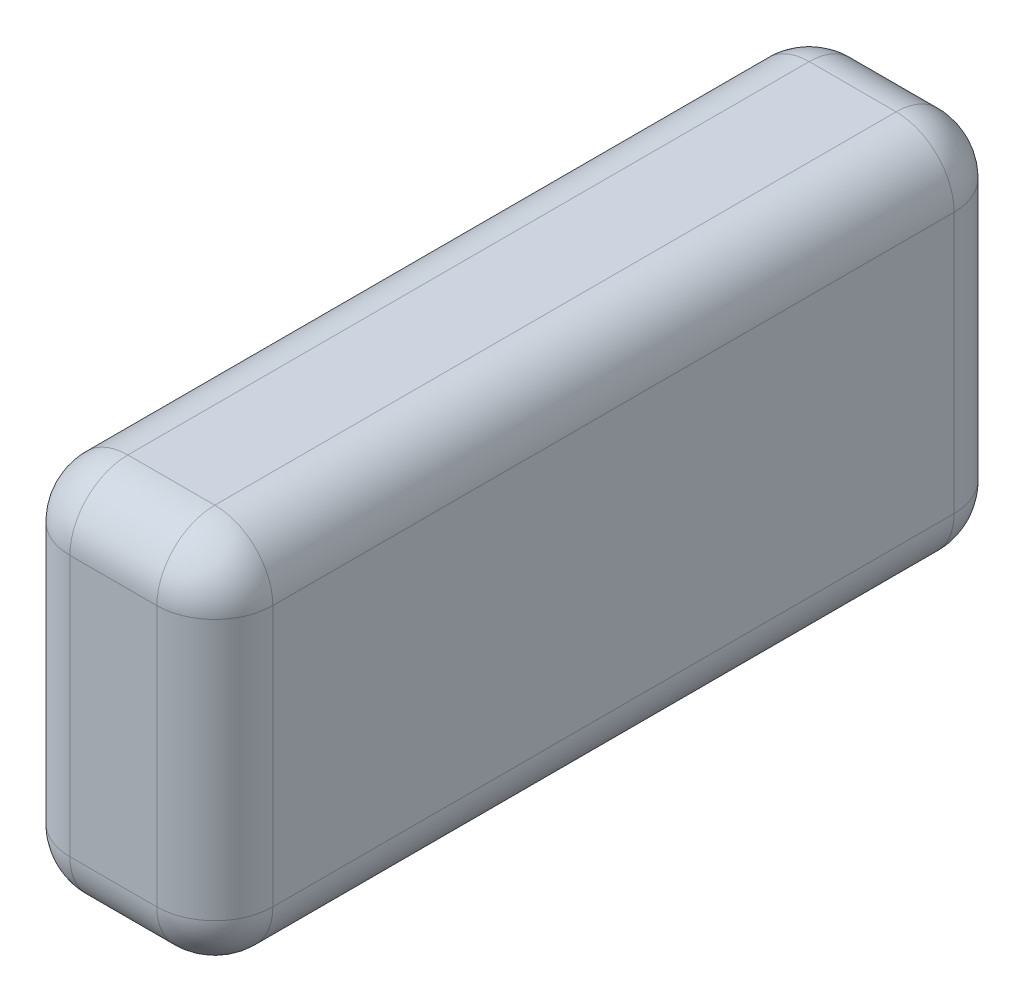
ISO-10303-21;
HEADER;
FILE_DESCRIPTION(('STEP AP214'),'2;1');
FILE_NAME('part.step','',(''),(''),'','','');
FILE_SCHEMA(('AUTOMOTIVE_DESIGN { 1 0 10303 214 1 1 1 1 }'));
ENDSEC;
DATA;
#1=APPLICATION_CONTEXT('core data for automotive mechanical design processes');
#2=APPLICATION_PROTOCOL_DEFINITION('international standard','automotive_design',2000,#1);
#3=PRODUCT_CONTEXT('',#1,'mechanical');
#4=PRODUCT('Part','Part','',(#3));
#5=PRODUCT_RELATED_PRODUCT_CATEGORY('part','',(#4));
#6=PRODUCT_DEFINITION_FORMATION('','',#4);
#7=PRODUCT_DEFINITION_CONTEXT('part definition',#1,'design');
#8=PRODUCT_DEFINITION('design','',#6,#7);
#9=PRODUCT_DEFINITION_SHAPE('','',#8);
#10=(LENGTH_UNIT() NAMED_UNIT(*) SI_UNIT(.MILLI.,.METRE.));
#11=(NAMED_UNIT(*) PLANE_ANGLE_UNIT() SI_UNIT($,.RADIAN.));
#12=(NAMED_UNIT(*) SI_UNIT($,.STERADIAN.) SOLID_ANGLE_UNIT());
#13=UNCERTAINTY_MEASURE_WITH_UNIT(LENGTH_MEASURE(1.E-05),#10,'distance_accuracy_value','');
#14=(GEOMETRIC_REPRESENTATION_CONTEXT(3) GLOBAL_UNCERTAINTY_ASSIGNED_CONTEXT((#13)) GLOBAL_UNIT_ASSIGNED_CONTEXT((#10,
#11,#12)) REPRESENTATION_CONTEXT('',''));
#15=CARTESIAN_POINT('',(0.,0.,0.));
#16=DIRECTION('',(0.,0.,1.));
#17=DIRECTION('',(1.,0.,0.));
#18=AXIS2_PLACEMENT_3D('',#15,#16,#17);
#19=CARTESIAN_POINT('',(-14.,-26.,110.));
#20=DIRECTION('',(1.,0.,0.));
#21=DIRECTION('',(0.,0.,-1.));
#22=AXIS2_PLACEMENT_3D('',#19,#20,#21);
#23=PLANE('',#22);
#24=DIRECTION('',(0.,-1.,0.));
#25=VECTOR('',#24,1.);
#26=CARTESIAN_POINT('',(-14.,26.,102.));
#27=LINE('',#26,#25);
#28=CARTESIAN_POINT('',(-14.,-18.,102.));
#29=VERTEX_POINT('',#28);
#30=CARTESIAN_POINT('',(-14.,18.,102.));
#31=VERTEX_POINT('',#30);
#32=EDGE_CURVE('E193',#29,#31,#27,.F.);
#33=ORIENTED_EDGE('',*,*,#32,.T.);
#34=DIRECTION('',(0.,0.,-1.));
#35=VECTOR('',#34,1.);
#36=CARTESIAN_POINT('',(-14.,18.,110.));
#37=LINE('',#36,#35);
#38=CARTESIAN_POINT('',(-14.,18.,7.99999999999999));
#39=VERTEX_POINT('',#38);
#40=EDGE_CURVE('E198',#31,#39,#37,.T.);
#41=ORIENTED_EDGE('',*,*,#40,.T.);
#42=DIRECTION('',(0.,-1.,0.));
#43=VECTOR('',#42,1.);
#44=CARTESIAN_POINT('',(-14.,-26.,7.99999999999999));
#45=LINE('',#44,#43);
#46=CARTESIAN_POINT('',(-14.,-18.,7.99999999999999));
#47=VERTEX_POINT('',#46);
#48=EDGE_CURVE('E195',#39,#47,#45,.T.);
#49=ORIENTED_EDGE('',*,*,#48,.T.);
#50=DIRECTION('',(0.,0.,-1.));
#51=VECTOR('',#50,1.);
#52=CARTESIAN_POINT('',(-14.,-18.,110.));
#53=LINE('',#52,#51);
#54=EDGE_CURVE('E191',#47,#29,#53,.F.);
#55=ORIENTED_EDGE('',*,*,#54,.T.);
#56=EDGE_LOOP('',(#33,#41,#49,#55));
#57=FACE_BOUND('',#56,.T.);
#58=ADVANCED_FACE('F39',(#57),#23,.F.);
#59=CARTESIAN_POINT('',(14.,-26.,110.));
#60=DIRECTION('',(0.,1.,0.));
#61=DIRECTION('',(-1.,0.,0.));
#62=AXIS2_PLACEMENT_3D('',#59,#60,#61);
#63=PLANE('',#62);
#64=DIRECTION('',(1.,0.,0.));
#65=VECTOR('',#64,1.);
#66=CARTESIAN_POINT('',(-14.,-26.,102.));
#67=LINE('',#66,#65);
#68=CARTESIAN_POINT('',(6.,-26.,102.));
#69=VERTEX_POINT('',#68);
#70=CARTESIAN_POINT('',(-6.,-26.,102.));
#71=VERTEX_POINT('',#70);
#72=EDGE_CURVE('E156',#69,#71,#67,.F.);
#73=ORIENTED_EDGE('',*,*,#72,.T.);
#74=DIRECTION('',(0.,0.,-1.));
#75=VECTOR('',#74,1.);
#76=CARTESIAN_POINT('',(-5.99999999999999,-26.,110.));
#77=LINE('',#76,#75);
#78=CARTESIAN_POINT('',(-6.,-26.,7.99999999999999));
#79=VERTEX_POINT('',#78);
#80=EDGE_CURVE('E160',#71,#79,#77,.T.);
#81=ORIENTED_EDGE('',*,*,#80,.T.);
#82=DIRECTION('',(1.,0.,0.));
#83=VECTOR('',#82,1.);
#84=CARTESIAN_POINT('',(14.,-26.,7.99999999999999));
#85=LINE('',#84,#83);
#86=CARTESIAN_POINT('',(6.,-26.,7.99999999999999));
#87=VERTEX_POINT('',#86);
#88=EDGE_CURVE('E132',#79,#87,#85,.T.);
#89=ORIENTED_EDGE('',*,*,#88,.T.);
#90=DIRECTION('',(0.,0.,-1.));
#91=VECTOR('',#90,1.);
#92=CARTESIAN_POINT('',(6.,-26.,110.));
#93=LINE('',#92,#91);
#94=EDGE_CURVE('E150',#87,#69,#93,.F.);
#95=ORIENTED_EDGE('',*,*,#94,.T.);
#96=EDGE_LOOP('',(#73,#81,#89,#95));
#97=FACE_BOUND('',#96,.T.);
#98=ADVANCED_FACE('F158',(#97),#63,.F.);
#99=CARTESIAN_POINT('',(14.,-26.,110.));
#100=DIRECTION('',(-1.,0.,0.));
#101=DIRECTION('',(0.,0.,1.));
#102=AXIS2_PLACEMENT_3D('',#99,#100,#101);
#103=PLANE('',#102);
#104=DIRECTION('',(0.,1.,0.));
#105=VECTOR('',#104,1.);
#106=CARTESIAN_POINT('',(14.,-26.,7.99999999999999));
#107=LINE('',#106,#105);
#108=CARTESIAN_POINT('',(14.,-18.,7.99999999999999));
#109=VERTEX_POINT('',#108);
#110=CARTESIAN_POINT('',(14.,18.,7.99999999999999));
#111=VERTEX_POINT('',#110);
#112=EDGE_CURVE('E177',#109,#111,#107,.T.);
#113=ORIENTED_EDGE('',*,*,#112,.T.);
#114=DIRECTION('',(0.,0.,-1.));
#115=VECTOR('',#114,1.);
#116=CARTESIAN_POINT('',(14.,18.,110.));
#117=LINE('',#116,#115);
#118=CARTESIAN_POINT('',(14.,18.,102.));
#119=VERTEX_POINT('',#118);
#120=EDGE_CURVE('E180',#111,#119,#117,.F.);
#121=ORIENTED_EDGE('',*,*,#120,.T.);
#122=DIRECTION('',(0.,1.,0.));
#123=VECTOR('',#122,1.);
#124=CARTESIAN_POINT('',(14.,-26.,102.));
#125=LINE('',#124,#123);
#126=CARTESIAN_POINT('',(14.,-18.,102.));
#127=VERTEX_POINT('',#126);
#128=EDGE_CURVE('E175',#119,#127,#125,.F.);
#129=ORIENTED_EDGE('',*,*,#128,.T.);
#130=DIRECTION('',(0.,0.,-1.));
#131=VECTOR('',#130,1.);
#132=CARTESIAN_POINT('',(14.,-18.,110.));
#133=LINE('',#132,#131);
#134=EDGE_CURVE('E173',#127,#109,#133,.T.);
#135=ORIENTED_EDGE('',*,*,#134,.T.);
#136=EDGE_LOOP('',(#113,#121,#129,#135));
#137=FACE_BOUND('',#136,.T.);
#138=ADVANCED_FACE('F333',(#137),#103,.F.);
#139=CARTESIAN_POINT('',(14.,26.,110.));
#140=DIRECTION('',(0.,-1.,0.));
#141=DIRECTION('',(1.,0.,0.));
#142=AXIS2_PLACEMENT_3D('',#139,#140,#141);
#143=PLANE('',#142);
#144=DIRECTION('',(-1.,0.,0.));
#145=VECTOR('',#144,1.);
#146=CARTESIAN_POINT('',(14.,26.,7.99999999999999));
#147=LINE('',#146,#145);
#148=CARTESIAN_POINT('',(6.,26.,7.99999999999999));
#149=VERTEX_POINT('',#148);
#150=CARTESIAN_POINT('',(-6.,26.,7.99999999999999));
#151=VERTEX_POINT('',#150);
#152=EDGE_CURVE('E186',#149,#151,#147,.T.);
#153=ORIENTED_EDGE('',*,*,#152,.T.);
#154=DIRECTION('',(0.,0.,-1.));
#155=VECTOR('',#154,1.);
#156=CARTESIAN_POINT('',(-6.,26.,110.));
#157=LINE('',#156,#155);
#158=CARTESIAN_POINT('',(-6.,26.,102.));
#159=VERTEX_POINT('',#158);
#160=EDGE_CURVE('E189',#151,#159,#157,.F.);
#161=ORIENTED_EDGE('',*,*,#160,.T.);
#162=DIRECTION('',(-1.,0.,0.));
#163=VECTOR('',#162,1.);
#164=CARTESIAN_POINT('',(14.,26.,102.));
#165=LINE('',#164,#163);
#166=CARTESIAN_POINT('',(6.,26.,102.));
#167=VERTEX_POINT('',#166);
#168=EDGE_CURVE('E184',#159,#167,#165,.F.);
#169=ORIENTED_EDGE('',*,*,#168,.T.);
#170=DIRECTION('',(0.,0.,-1.));
#171=VECTOR('',#170,1.);
#172=CARTESIAN_POINT('',(6.,26.,110.));
#173=LINE('',#172,#171);
#174=EDGE_CURVE('E182',#167,#149,#173,.T.);
#175=ORIENTED_EDGE('',*,*,#174,.T.);
#176=EDGE_LOOP('',(#153,#161,#169,#175));
#177=FACE_BOUND('',#176,.T.);
#178=ADVANCED_FACE('F300',(#177),#143,.F.);
#179=CARTESIAN_POINT('',(0.,0.,110.));
#180=DIRECTION('',(0.,0.,1.));
#181=DIRECTION('',(1.,0.,0.));
#182=AXIS2_PLACEMENT_3D('',#179,#180,#181);
#183=PLANE('',#182);
#184=DIRECTION('',(0.,1.,0.));
#185=VECTOR('',#184,1.);
#186=CARTESIAN_POINT('',(6.,26.,110.));
#187=LINE('',#186,#185);
#188=CARTESIAN_POINT('',(6.,-18.,110.));
#189=VERTEX_POINT('',#188);
#190=CARTESIAN_POINT('',(6.,18.,110.));
#191=VERTEX_POINT('',#190);
#192=EDGE_CURVE('E48',#189,#191,#187,.T.);
#193=ORIENTED_EDGE('',*,*,#192,.T.);
#194=DIRECTION('',(-1.,0.,0.));
#195=VECTOR('',#194,1.);
#196=CARTESIAN_POINT('',(-14.,18.,110.));
#197=LINE('',#196,#195);
#198=CARTESIAN_POINT('',(-6.,18.,110.));
#199=VERTEX_POINT('',#198);
#200=EDGE_CURVE('E11',#191,#199,#197,.T.);
#201=ORIENTED_EDGE('',*,*,#200,.T.);
#202=DIRECTION('',(0.,-1.,0.));
#203=VECTOR('',#202,1.);
#204=CARTESIAN_POINT('',(-6.,-26.,110.));
#205=LINE('',#204,#203);
#206=CARTESIAN_POINT('',(-6.,-18.,110.));
#207=VERTEX_POINT('',#206);
#208=EDGE_CURVE('E200',#199,#207,#205,.T.);
#209=ORIENTED_EDGE('',*,*,#208,.T.);
#210=DIRECTION('',(1.,0.,0.));
#211=VECTOR('',#210,1.);
#212=CARTESIAN_POINT('',(14.,-18.,110.));
#213=LINE('',#212,#211);
#214=EDGE_CURVE('E59',#207,#189,#213,.T.);
#215=ORIENTED_EDGE('',*,*,#214,.T.);
#216=EDGE_LOOP('',(#193,#201,#209,#215));
#217=FACE_BOUND('',#216,.T.);
#218=ADVANCED_FACE('F280',(#217),#183,.T.);
#219=CARTESIAN_POINT('',(0.,0.,0.));
#220=DIRECTION('',(0.,0.,1.));
#221=DIRECTION('',(1.,0.,0.));
#222=AXIS2_PLACEMENT_3D('',#219,#220,#221);
#223=PLANE('',#222);
#224=DIRECTION('',(0.,1.,0.));
#225=VECTOR('',#224,1.);
#226=CARTESIAN_POINT('',(6.,0.,0.));
#227=LINE('',#226,#225);
#228=CARTESIAN_POINT('',(6.,18.,0.));
#229=VERTEX_POINT('',#228);
#230=CARTESIAN_POINT('',(6.,-18.,0.));
#231=VERTEX_POINT('',#230);
#232=EDGE_CURVE('E170',#229,#231,#227,.F.);
#233=ORIENTED_EDGE('',*,*,#232,.T.);
#234=DIRECTION('',(1.,0.,0.));
#235=VECTOR('',#234,1.);
#236=CARTESIAN_POINT('',(0.,-18.,0.));
#237=LINE('',#236,#235);
#238=CARTESIAN_POINT('',(-6.,-18.,0.));
#239=VERTEX_POINT('',#238);
#240=EDGE_CURVE('E134',#231,#239,#237,.F.);
#241=ORIENTED_EDGE('',*,*,#240,.T.);
#242=DIRECTION('',(0.,-1.,0.));
#243=VECTOR('',#242,1.);
#244=CARTESIAN_POINT('',(-6.,0.,0.));
#245=LINE('',#244,#243);
#246=CARTESIAN_POINT('',(-6.,18.,0.));
#247=VERTEX_POINT('',#246);
#248=EDGE_CURVE('E163',#239,#247,#245,.F.);
#249=ORIENTED_EDGE('',*,*,#248,.T.);
#250=DIRECTION('',(-1.,0.,0.));
#251=VECTOR('',#250,1.);
#252=CARTESIAN_POINT('',(0.,18.,0.));
#253=LINE('',#252,#251);
#254=EDGE_CURVE('E168',#247,#229,#253,.F.);
#255=ORIENTED_EDGE('',*,*,#254,.T.);
#256=EDGE_LOOP('',(#233,#241,#249,#255));
#257=FACE_BOUND('',#256,.T.);
#258=ADVANCED_FACE('F361',(#257),#223,.F.);
#259=CARTESIAN_POINT('',(0.,18.,102.));
#260=DIRECTION('',(1.,0.,0.));
#261=DIRECTION('',(0.,1.,0.));
#262=AXIS2_PLACEMENT_3D('',#259,#260,#261);
#263=CYLINDRICAL_SURFACE('',#262,8.);
#264=CARTESIAN_POINT('',(-6.,18.,102.));
#265=DIRECTION('',(-1.,0.,0.));
#266=DIRECTION('',(0.,-1.,0.));
#267=AXIS2_PLACEMENT_3D('',#264,#265,#266);
#268=CIRCLE('',#267,8.);
#269=EDGE_CURVE('E43',#199,#159,#268,.T.);
#270=ORIENTED_EDGE('',*,*,#269,.F.);
#271=ORIENTED_EDGE('',*,*,#200,.F.);
#272=CARTESIAN_POINT('',(6.,18.,102.));
#273=DIRECTION('',(1.,0.,0.));
#274=DIRECTION('',(0.,1.,0.));
#275=AXIS2_PLACEMENT_3D('',#272,#273,#274);
#276=CIRCLE('',#275,8.);
#277=EDGE_CURVE('E253',#167,#191,#276,.T.);
#278=ORIENTED_EDGE('',*,*,#277,.F.);
#279=ORIENTED_EDGE('',*,*,#168,.F.);
#280=EDGE_LOOP('',(#270,#271,#278,#279));
#281=FACE_BOUND('',#280,.T.);
#282=ADVANCED_FACE('F41',(#281),#263,.T.);
#283=CARTESIAN_POINT('',(-6.,18.,102.));
#284=DIRECTION('',(0.,1.,0.));
#285=DIRECTION('',(-1.,0.,0.));
#286=AXIS2_PLACEMENT_3D('',#283,#284,#285);
#287=SPHERICAL_SURFACE('',#286,8.);
#288=CARTESIAN_POINT('',(-6.,18.,102.));
#289=DIRECTION('',(0.,1.,0.));
#290=DIRECTION('',(0.,0.,1.));
#291=AXIS2_PLACEMENT_3D('',#288,#289,#290);
#292=CIRCLE('',#291,8.);
#293=EDGE_CURVE('E248',#199,#31,#292,.F.);
#294=ORIENTED_EDGE('',*,*,#293,.F.);
#295=ORIENTED_EDGE('',*,*,#269,.T.);
#296=CARTESIAN_POINT('',(-6.,18.,102.));
#297=DIRECTION('',(0.,0.,1.));
#298=DIRECTION('',(1.,0.,0.));
#299=AXIS2_PLACEMENT_3D('',#296,#297,#298);
#300=CIRCLE('',#299,8.);
#301=EDGE_CURVE('E251',#31,#159,#300,.F.);
#302=ORIENTED_EDGE('',*,*,#301,.F.);
#303=EDGE_LOOP('',(#294,#295,#302));
#304=FACE_BOUND('',#303,.T.);
#305=ADVANCED_FACE('F264',(#304),#287,.T.);
#306=CARTESIAN_POINT('',(6.,18.,102.));
#307=DIRECTION('',(0.,0.,1.));
#308=DIRECTION('',(1.,0.,0.));
#309=AXIS2_PLACEMENT_3D('',#306,#307,#308);
#310=SPHERICAL_SURFACE('',#309,8.);
#311=CARTESIAN_POINT('',(6.,18.,102.));
#312=DIRECTION('',(0.,0.,1.));
#313=DIRECTION('',(1.,0.,0.));
#314=AXIS2_PLACEMENT_3D('',#311,#312,#313);
#315=CIRCLE('',#314,8.);
#316=EDGE_CURVE('E242',#167,#119,#315,.F.);
#317=ORIENTED_EDGE('',*,*,#316,.F.);
#318=ORIENTED_EDGE('',*,*,#277,.T.);
#319=CARTESIAN_POINT('',(6.,18.,102.));
#320=DIRECTION('',(0.,1.,0.));
#321=DIRECTION('',(0.,0.,1.));
#322=AXIS2_PLACEMENT_3D('',#319,#320,#321);
#323=CIRCLE('',#322,8.);
#324=EDGE_CURVE('E245',#119,#191,#323,.F.);
#325=ORIENTED_EDGE('',*,*,#324,.F.);
#326=EDGE_LOOP('',(#317,#318,#325));
#327=FACE_BOUND('',#326,.T.);
#328=ADVANCED_FACE('F292',(#327),#310,.T.);
#329=CARTESIAN_POINT('',(-6.,18.,110.));
#330=DIRECTION('',(0.,0.,-1.));
#331=DIRECTION('',(-1.,0.,0.));
#332=AXIS2_PLACEMENT_3D('',#329,#330,#331);
#333=CYLINDRICAL_SURFACE('',#332,8.);
#334=ORIENTED_EDGE('',*,*,#301,.T.);
#335=ORIENTED_EDGE('',*,*,#160,.F.);
#336=CARTESIAN_POINT('',(-6.,18.,7.99999999999999));
#337=DIRECTION('',(0.,0.,-1.));
#338=DIRECTION('',(-1.,0.,0.));
#339=AXIS2_PLACEMENT_3D('',#336,#337,#338);
#340=CIRCLE('',#339,8.);
#341=EDGE_CURVE('E237',#39,#151,#340,.T.);
#342=ORIENTED_EDGE('',*,*,#341,.F.);
#343=ORIENTED_EDGE('',*,*,#40,.F.);
#344=EDGE_LOOP('',(#334,#335,#342,#343));
#345=FACE_BOUND('',#344,.T.);
#346=ADVANCED_FACE('F270',(#345),#333,.T.);
#347=CARTESIAN_POINT('',(-6.,0.,102.));
#348=DIRECTION('',(0.,1.,0.));
#349=DIRECTION('',(0.,0.,1.));
#350=AXIS2_PLACEMENT_3D('',#347,#348,#349);
#351=CYLINDRICAL_SURFACE('',#350,8.);
#352=ORIENTED_EDGE('',*,*,#293,.T.);
#353=ORIENTED_EDGE('',*,*,#32,.F.);
#354=CARTESIAN_POINT('',(-6.,-18.,102.));
#355=DIRECTION('',(0.,-1.,0.));
#356=DIRECTION('',(0.,0.,-1.));
#357=AXIS2_PLACEMENT_3D('',#354,#355,#356);
#358=CIRCLE('',#357,8.);
#359=EDGE_CURVE('E234',#207,#29,#358,.T.);
#360=ORIENTED_EDGE('',*,*,#359,.F.);
#361=ORIENTED_EDGE('',*,*,#208,.F.);
#362=EDGE_LOOP('',(#352,#353,#360,#361));
#363=FACE_BOUND('',#362,.T.);
#364=ADVANCED_FACE('F279',(#363),#351,.T.);
#365=CARTESIAN_POINT('',(0.,-18.,102.));
#366=DIRECTION('',(-1.,0.,0.));
#367=DIRECTION('',(0.,-1.,0.));
#368=AXIS2_PLACEMENT_3D('',#365,#366,#367);
#369=CYLINDRICAL_SURFACE('',#368,8.);
#370=CARTESIAN_POINT('',(6.,-18.,102.));
#371=DIRECTION('',(1.,0.,0.));
#372=DIRECTION('',(0.,1.,0.));
#373=AXIS2_PLACEMENT_3D('',#370,#371,#372);
#374=CIRCLE('',#373,8.);
#375=EDGE_CURVE('E228',#189,#69,#374,.T.);
#376=ORIENTED_EDGE('',*,*,#375,.F.);
#377=ORIENTED_EDGE('',*,*,#214,.F.);
#378=CARTESIAN_POINT('',(-6.,-18.,102.));
#379=DIRECTION('',(-1.,0.,0.));
#380=DIRECTION('',(0.,0.,1.));
#381=AXIS2_PLACEMENT_3D('',#378,#379,#380);
#382=CIRCLE('',#381,8.);
#383=EDGE_CURVE('E231',#71,#207,#382,.T.);
#384=ORIENTED_EDGE('',*,*,#383,.F.);
#385=ORIENTED_EDGE('',*,*,#72,.F.);
#386=EDGE_LOOP('',(#376,#377,#384,#385));
#387=FACE_BOUND('',#386,.T.);
#388=ADVANCED_FACE('F284',(#387),#369,.T.);
#389=CARTESIAN_POINT('',(6.,0.,102.));
#390=DIRECTION('',(0.,-1.,0.));
#391=DIRECTION('',(0.,0.,-1.));
#392=AXIS2_PLACEMENT_3D('',#389,#390,#391);
#393=CYLINDRICAL_SURFACE('',#392,8.);
#394=ORIENTED_EDGE('',*,*,#324,.T.);
#395=ORIENTED_EDGE('',*,*,#192,.F.);
#396=CARTESIAN_POINT('',(6.,-18.,102.));
#397=DIRECTION('',(0.,-1.,0.));
#398=DIRECTION('',(0.,0.,-1.));
#399=AXIS2_PLACEMENT_3D('',#396,#397,#398);
#400=CIRCLE('',#399,8.);
#401=EDGE_CURVE('E225',#127,#189,#400,.T.);
#402=ORIENTED_EDGE('',*,*,#401,.F.);
#403=ORIENTED_EDGE('',*,*,#128,.F.);
#404=EDGE_LOOP('',(#394,#395,#402,#403));
#405=FACE_BOUND('',#404,.T.);
#406=ADVANCED_FACE('F291',(#405),#393,.T.);
#407=CARTESIAN_POINT('',(6.,18.,110.));
#408=DIRECTION('',(0.,0.,-1.));
#409=DIRECTION('',(-1.,0.,0.));
#410=AXIS2_PLACEMENT_3D('',#407,#408,#409);
#411=CYLINDRICAL_SURFACE('',#410,8.);
#412=ORIENTED_EDGE('',*,*,#316,.T.);
#413=ORIENTED_EDGE('',*,*,#120,.F.);
#414=CARTESIAN_POINT('',(6.,18.,7.99999999999999));
#415=DIRECTION('',(0.,0.,-1.));
#416=DIRECTION('',(-1.,0.,0.));
#417=AXIS2_PLACEMENT_3D('',#414,#415,#416);
#418=CIRCLE('',#417,8.);
#419=EDGE_CURVE('E222',#149,#111,#418,.T.);
#420=ORIENTED_EDGE('',*,*,#419,.F.);
#421=ORIENTED_EDGE('',*,*,#174,.F.);
#422=EDGE_LOOP('',(#412,#413,#420,#421));
#423=FACE_BOUND('',#422,.T.);
#424=ADVANCED_FACE('F297',(#423),#411,.T.);
#425=CARTESIAN_POINT('',(14.,18.,7.99999999999999));
#426=DIRECTION('',(-1.,0.,0.));
#427=DIRECTION('',(0.,-1.,0.));
#428=AXIS2_PLACEMENT_3D('',#425,#426,#427);
#429=CYLINDRICAL_SURFACE('',#428,8.);
#430=CARTESIAN_POINT('',(-6.,18.,7.99999999999999));
#431=DIRECTION('',(-1.,0.,0.));
#432=DIRECTION('',(0.,-1.,0.));
#433=AXIS2_PLACEMENT_3D('',#430,#431,#432);
#434=CIRCLE('',#433,8.);
#435=EDGE_CURVE('E239',#151,#247,#434,.T.);
#436=ORIENTED_EDGE('',*,*,#435,.F.);
#437=ORIENTED_EDGE('',*,*,#152,.F.);
#438=CARTESIAN_POINT('',(6.,18.,8.));
#439=DIRECTION('',(1.,0.,0.));
#440=DIRECTION('',(0.,1.,0.));
#441=AXIS2_PLACEMENT_3D('',#438,#439,#440);
#442=CIRCLE('',#441,8.);
#443=EDGE_CURVE('E219',#229,#149,#442,.T.);
#444=ORIENTED_EDGE('',*,*,#443,.F.);
#445=ORIENTED_EDGE('',*,*,#254,.F.);
#446=EDGE_LOOP('',(#436,#437,#444,#445));
#447=FACE_BOUND('',#446,.T.);
#448=ADVANCED_FACE('F304',(#447),#429,.T.);
#449=CARTESIAN_POINT('',(-6.,18.,8.));
#450=DIRECTION('',(0.,1.,0.));
#451=DIRECTION('',(0.,0.,1.));
#452=AXIS2_PLACEMENT_3D('',#449,#450,#451);
#453=SPHERICAL_SURFACE('',#452,8.);
#454=ORIENTED_EDGE('',*,*,#341,.T.);
#455=ORIENTED_EDGE('',*,*,#435,.T.);
#456=CARTESIAN_POINT('',(-6.,18.,8.));
#457=DIRECTION('',(0.,1.,0.));
#458=DIRECTION('',(0.,0.,1.));
#459=AXIS2_PLACEMENT_3D('',#456,#457,#458);
#460=CIRCLE('',#459,8.);
#461=EDGE_CURVE('E216',#39,#247,#460,.F.);
#462=ORIENTED_EDGE('',*,*,#461,.F.);
#463=EDGE_LOOP('',(#454,#455,#462));
#464=FACE_BOUND('',#463,.T.);
#465=ADVANCED_FACE('F308',(#464),#453,.T.);
#466=CARTESIAN_POINT('',(-6.,-18.,102.));
#467=DIRECTION('',(0.,0.,1.));
#468=DIRECTION('',(1.,0.,0.));
#469=AXIS2_PLACEMENT_3D('',#466,#467,#468);
#470=SPHERICAL_SURFACE('',#469,8.);
#471=ORIENTED_EDGE('',*,*,#383,.T.);
#472=ORIENTED_EDGE('',*,*,#359,.T.);
#473=CARTESIAN_POINT('',(-6.,-18.,102.));
#474=DIRECTION('',(0.,0.,1.));
#475=DIRECTION('',(1.,0.,0.));
#476=AXIS2_PLACEMENT_3D('',#473,#474,#475);
#477=CIRCLE('',#476,8.);
#478=EDGE_CURVE('E213',#71,#29,#477,.F.);
#479=ORIENTED_EDGE('',*,*,#478,.F.);
#480=EDGE_LOOP('',(#471,#472,#479));
#481=FACE_BOUND('',#480,.T.);
#482=ADVANCED_FACE('F318',(#481),#470,.T.);
#483=CARTESIAN_POINT('',(6.,-18.,102.));
#484=DIRECTION('',(0.,0.,1.));
#485=DIRECTION('',(1.,0.,0.));
#486=AXIS2_PLACEMENT_3D('',#483,#484,#485);
#487=SPHERICAL_SURFACE('',#486,8.);
#488=ORIENTED_EDGE('',*,*,#401,.T.);
#489=ORIENTED_EDGE('',*,*,#375,.T.);
#490=CARTESIAN_POINT('',(6.,-18.,102.));
#491=DIRECTION('',(0.,0.,1.));
#492=DIRECTION('',(1.,0.,0.));
#493=AXIS2_PLACEMENT_3D('',#490,#491,#492);
#494=CIRCLE('',#493,8.);
#495=EDGE_CURVE('E153',#127,#69,#494,.F.);
#496=ORIENTED_EDGE('',*,*,#495,.F.);
#497=EDGE_LOOP('',(#488,#489,#496));
#498=FACE_BOUND('',#497,.T.);
#499=ADVANCED_FACE('F288',(#498),#487,.T.);
#500=CARTESIAN_POINT('',(6.,18.,8.));
#501=DIRECTION('',(0.,1.,0.));
#502=DIRECTION('',(0.,0.,1.));
#503=AXIS2_PLACEMENT_3D('',#500,#501,#502);
#504=SPHERICAL_SURFACE('',#503,8.);
#505=ORIENTED_EDGE('',*,*,#443,.T.);
#506=ORIENTED_EDGE('',*,*,#419,.T.);
#507=CARTESIAN_POINT('',(6.,18.,7.99999999999999));
#508=DIRECTION('',(0.,1.,0.));
#509=DIRECTION('',(0.,0.,1.));
#510=AXIS2_PLACEMENT_3D('',#507,#508,#509);
#511=CIRCLE('',#510,8.);
#512=EDGE_CURVE('E210',#229,#111,#511,.F.);
#513=ORIENTED_EDGE('',*,*,#512,.F.);
#514=EDGE_LOOP('',(#505,#506,#513));
#515=FACE_BOUND('',#514,.T.);
#516=ADVANCED_FACE('F325',(#515),#504,.T.);
#517=CARTESIAN_POINT('',(-6.,-26.,7.99999999999999));
#518=DIRECTION('',(0.,-1.,0.));
#519=DIRECTION('',(0.,0.,-1.));
#520=AXIS2_PLACEMENT_3D('',#517,#518,#519);
#521=CYLINDRICAL_SURFACE('',#520,8.);
#522=ORIENTED_EDGE('',*,*,#461,.T.);
#523=ORIENTED_EDGE('',*,*,#248,.F.);
#524=CARTESIAN_POINT('',(-6.,-18.,7.99999999999999));
#525=DIRECTION('',(0.,-1.,0.));
#526=DIRECTION('',(0.,0.,-1.));
#527=AXIS2_PLACEMENT_3D('',#524,#525,#526);
#528=CIRCLE('',#527,8.);
#529=EDGE_CURVE('E207',#47,#239,#528,.T.);
#530=ORIENTED_EDGE('',*,*,#529,.F.);
#531=ORIENTED_EDGE('',*,*,#48,.F.);
#532=EDGE_LOOP('',(#522,#523,#530,#531));
#533=FACE_BOUND('',#532,.T.);
#534=ADVANCED_FACE('F311',(#533),#521,.T.);
#535=CARTESIAN_POINT('',(-6.,-18.,110.));
#536=DIRECTION('',(0.,0.,-1.));
#537=DIRECTION('',(-1.,0.,0.));
#538=AXIS2_PLACEMENT_3D('',#535,#536,#537);
#539=CYLINDRICAL_SURFACE('',#538,8.);
#540=ORIENTED_EDGE('',*,*,#478,.T.);
#541=ORIENTED_EDGE('',*,*,#54,.F.);
#542=CARTESIAN_POINT('',(-6.,-18.,7.99999999999999));
#543=DIRECTION('',(0.,0.,-1.));
#544=DIRECTION('',(-1.,0.,0.));
#545=AXIS2_PLACEMENT_3D('',#542,#543,#544);
#546=CIRCLE('',#545,8.);
#547=EDGE_CURVE('E147',#79,#47,#546,.T.);
#548=ORIENTED_EDGE('',*,*,#547,.F.);
#549=ORIENTED_EDGE('',*,*,#80,.F.);
#550=EDGE_LOOP('',(#540,#541,#548,#549));
#551=FACE_BOUND('',#550,.T.);
#552=ADVANCED_FACE('F316',(#551),#539,.T.);
#553=CARTESIAN_POINT('',(6.,-18.,110.));
#554=DIRECTION('',(0.,0.,-1.));
#555=DIRECTION('',(-1.,0.,0.));
#556=AXIS2_PLACEMENT_3D('',#553,#554,#555);
#557=CYLINDRICAL_SURFACE('',#556,8.);
#558=ORIENTED_EDGE('',*,*,#495,.T.);
#559=ORIENTED_EDGE('',*,*,#94,.F.);
#560=CARTESIAN_POINT('',(6.,-18.,7.99999999999999));
#561=DIRECTION('',(0.,0.,-1.));
#562=DIRECTION('',(-1.,0.,0.));
#563=AXIS2_PLACEMENT_3D('',#560,#561,#562);
#564=CIRCLE('',#563,8.);
#565=EDGE_CURVE('E140',#109,#87,#564,.T.);
#566=ORIENTED_EDGE('',*,*,#565,.F.);
#567=ORIENTED_EDGE('',*,*,#134,.F.);
#568=EDGE_LOOP('',(#558,#559,#566,#567));
#569=FACE_BOUND('',#568,.T.);
#570=ADVANCED_FACE('F151',(#569),#557,.T.);
#571=CARTESIAN_POINT('',(6.,-26.,7.99999999999999));
#572=DIRECTION('',(0.,1.,0.));
#573=DIRECTION('',(0.,0.,1.));
#574=AXIS2_PLACEMENT_3D('',#571,#572,#573);
#575=CYLINDRICAL_SURFACE('',#574,8.);
#576=ORIENTED_EDGE('',*,*,#512,.T.);
#577=ORIENTED_EDGE('',*,*,#112,.F.);
#578=CARTESIAN_POINT('',(6.,-18.,8.));
#579=DIRECTION('',(0.,-1.,0.));
#580=DIRECTION('',(1.,0.,0.));
#581=AXIS2_PLACEMENT_3D('',#578,#579,#580);
#582=CIRCLE('',#581,8.);
#583=EDGE_CURVE('E144',#231,#109,#582,.T.);
#584=ORIENTED_EDGE('',*,*,#583,.F.);
#585=ORIENTED_EDGE('',*,*,#232,.F.);
#586=EDGE_LOOP('',(#576,#577,#584,#585));
#587=FACE_BOUND('',#586,.T.);
#588=ADVANCED_FACE('F344',(#587),#575,.T.);
#589=CARTESIAN_POINT('',(-6.,-18.,8.));
#590=DIRECTION('',(-1.,0.,0.));
#591=DIRECTION('',(0.,0.,1.));
#592=AXIS2_PLACEMENT_3D('',#589,#590,#591);
#593=SPHERICAL_SURFACE('',#592,8.);
#594=ORIENTED_EDGE('',*,*,#547,.T.);
#595=ORIENTED_EDGE('',*,*,#529,.T.);
#596=CARTESIAN_POINT('',(-6.,-18.,8.));
#597=DIRECTION('',(-1.,0.,0.));
#598=DIRECTION('',(0.,-1.,0.));
#599=AXIS2_PLACEMENT_3D('',#596,#597,#598);
#600=CIRCLE('',#599,8.);
#601=EDGE_CURVE('E137',#79,#239,#600,.F.);
#602=ORIENTED_EDGE('',*,*,#601,.F.);
#603=EDGE_LOOP('',(#594,#595,#602));
#604=FACE_BOUND('',#603,.T.);
#605=ADVANCED_FACE('F341',(#604),#593,.T.);
#606=CARTESIAN_POINT('',(6.,-18.,8.));
#607=DIRECTION('',(1.,0.,0.));
#608=DIRECTION('',(0.,0.,-1.));
#609=AXIS2_PLACEMENT_3D('',#606,#607,#608);
#610=SPHERICAL_SURFACE('',#609,8.);
#611=ORIENTED_EDGE('',*,*,#583,.T.);
#612=ORIENTED_EDGE('',*,*,#565,.T.);
#613=CARTESIAN_POINT('',(6.,-18.,7.99999999999999));
#614=DIRECTION('',(1.,0.,0.));
#615=DIRECTION('',(0.,1.,0.));
#616=AXIS2_PLACEMENT_3D('',#613,#614,#615);
#617=CIRCLE('',#616,8.);
#618=EDGE_CURVE('E128',#231,#87,#617,.F.);
#619=ORIENTED_EDGE('',*,*,#618,.F.);
#620=EDGE_LOOP('',(#611,#612,#619));
#621=FACE_BOUND('',#620,.T.);
#622=ADVANCED_FACE('F142',(#621),#610,.T.);
#623=CARTESIAN_POINT('',(14.,-18.,7.99999999999999));
#624=DIRECTION('',(1.,0.,0.));
#625=DIRECTION('',(0.,1.,0.));
#626=AXIS2_PLACEMENT_3D('',#623,#624,#625);
#627=CYLINDRICAL_SURFACE('',#626,8.);
#628=ORIENTED_EDGE('',*,*,#601,.T.);
#629=ORIENTED_EDGE('',*,*,#240,.F.);
#630=ORIENTED_EDGE('',*,*,#618,.T.);
#631=ORIENTED_EDGE('',*,*,#88,.F.);
#632=EDGE_LOOP('',(#628,#629,#630,#631));
#633=FACE_BOUND('',#632,.T.);
#634=ADVANCED_FACE('F130',(#633),#627,.T.);
#635=CLOSED_SHELL('',(#58,#98,#138,#178,#218,#258,#282,#305,#328,#346,#364,#388,#406,#424,#448,
#465,#482,#499,#516,#534,#552,#570,#588,#605,#622,#634));
#636=MANIFOLD_SOLID_BREP('B2',#635);
#637=ADVANCED_BREP_SHAPE_REPRESENTATION('',(#18,#636),#14);
#638=SHAPE_DEFINITION_REPRESENTATION(#9,#637);
ENDSEC;
END-ISO-10303-21;
